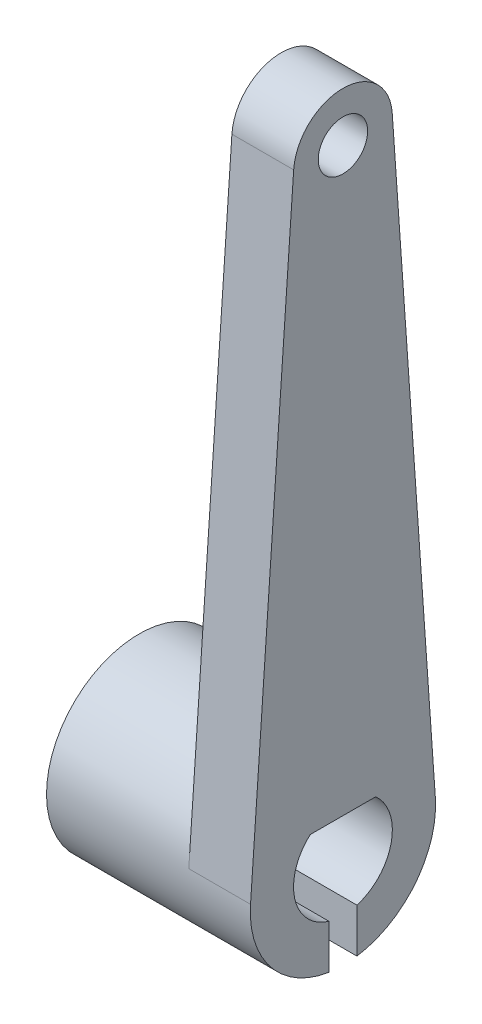
ISO-10303-21;
HEADER;
FILE_DESCRIPTION(('STEP AP214'),'2;1');
FILE_NAME('part.step','',(''),(''),'','','');
FILE_SCHEMA(('AUTOMOTIVE_DESIGN { 1 0 10303 214 1 1 1 1 }'));
ENDSEC;
DATA;
#1=APPLICATION_CONTEXT('core data for automotive mechanical design processes');
#2=APPLICATION_PROTOCOL_DEFINITION('international standard','automotive_design',2000,#1);
#3=PRODUCT_CONTEXT('',#1,'mechanical');
#4=PRODUCT('Part','Part','',(#3));
#5=PRODUCT_RELATED_PRODUCT_CATEGORY('part','',(#4));
#6=PRODUCT_DEFINITION_FORMATION('','',#4);
#7=PRODUCT_DEFINITION_CONTEXT('part definition',#1,'design');
#8=PRODUCT_DEFINITION('design','',#6,#7);
#9=PRODUCT_DEFINITION_SHAPE('','',#8);
#10=(LENGTH_UNIT() NAMED_UNIT(*) SI_UNIT(.MILLI.,.METRE.));
#11=(NAMED_UNIT(*) PLANE_ANGLE_UNIT() SI_UNIT($,.RADIAN.));
#12=(NAMED_UNIT(*) SI_UNIT($,.STERADIAN.) SOLID_ANGLE_UNIT());
#13=UNCERTAINTY_MEASURE_WITH_UNIT(LENGTH_MEASURE(1.E-05),#10,'distance_accuracy_value','');
#14=(GEOMETRIC_REPRESENTATION_CONTEXT(3) GLOBAL_UNCERTAINTY_ASSIGNED_CONTEXT((#13)) GLOBAL_UNIT_ASSIGNED_CONTEXT((#10,
#11,#12)) REPRESENTATION_CONTEXT('',''));
#15=CARTESIAN_POINT('',(0.,0.,0.));
#16=DIRECTION('',(0.,0.,1.));
#17=DIRECTION('',(1.,0.,0.));
#18=AXIS2_PLACEMENT_3D('',#15,#16,#17);
#19=CARTESIAN_POINT('',(-2.5,0.,0.));
#20=DIRECTION('',(1.,0.,0.));
#21=DIRECTION('',(0.,0.,-1.));
#22=AXIS2_PLACEMENT_3D('',#19,#20,#21);
#23=PLANE('',#22);
#24=CARTESIAN_POINT('',(-2.5,50.,0.));
#25=DIRECTION('',(1.,0.,0.));
#26=DIRECTION('',(0.,0.,-1.));
#27=AXIS2_PLACEMENT_3D('',#24,#25,#26);
#28=CIRCLE('',#27,2.);
#29=CARTESIAN_POINT('',(-2.5,50.,-2.));
#30=VERTEX_POINT('',#29);
#31=EDGE_CURVE('E181',#30,#30,#28,.T.);
#32=ORIENTED_EDGE('',*,*,#31,.T.);
#33=EDGE_LOOP('',(#32));
#34=FACE_BOUND('',#33,.T.);
#35=CARTESIAN_POINT('',(-2.5,0.,0.));
#36=DIRECTION('',(-1.,0.,0.));
#37=DIRECTION('',(0.,0.,1.));
#38=AXIS2_PLACEMENT_3D('',#35,#36,#37);
#39=CIRCLE('',#38,7.5);
#40=CARTESIAN_POINT('',(-2.5,0.525,7.48160243530756));
#41=VERTEX_POINT('',#40);
#42=CARTESIAN_POINT('',(-2.5,0.524999999999999,-7.48160243530756));
#43=VERTEX_POINT('',#42);
#44=EDGE_CURVE('E12',#41,#43,#39,.T.);
#45=ORIENTED_EDGE('',*,*,#44,.F.);
#46=DIRECTION('',(0.,0.997546991374341,-0.07));
#47=VECTOR('',#46,1.);
#48=CARTESIAN_POINT('',(-2.5,0.525,7.48160243530756));
#49=LINE('',#48,#47);
#50=CARTESIAN_POINT('',(-2.5,50.28,3.99018796549737));
#51=VERTEX_POINT('',#50);
#52=EDGE_CURVE('E190',#41,#51,#49,.T.);
#53=ORIENTED_EDGE('',*,*,#52,.T.);
#54=CARTESIAN_POINT('',(-2.5,50.,0.));
#55=DIRECTION('',(1.,0.,0.));
#56=DIRECTION('',(0.,0.,-1.));
#57=AXIS2_PLACEMENT_3D('',#54,#55,#56);
#58=CIRCLE('',#57,4.);
#59=CARTESIAN_POINT('',(-2.5,50.28,-3.99018796549737));
#60=VERTEX_POINT('',#59);
#61=EDGE_CURVE('E187',#60,#51,#58,.T.);
#62=ORIENTED_EDGE('',*,*,#61,.F.);
#63=DIRECTION('',(0.,-0.997546991374341,-0.07));
#64=VECTOR('',#63,1.);
#65=CARTESIAN_POINT('',(-2.5,0.525,-7.48160243530756));
#66=LINE('',#65,#64);
#67=EDGE_CURVE('E184',#60,#43,#66,.T.);
#68=ORIENTED_EDGE('',*,*,#67,.T.);
#69=EDGE_LOOP('',(#45,#53,#62,#68));
#70=FACE_BOUND('',#69,.T.);
#71=ADVANCED_FACE('F49',(#34,#70),#23,.F.);
#72=CARTESIAN_POINT('',(-2.5,0.,0.));
#73=DIRECTION('',(1.,0.,0.));
#74=DIRECTION('',(0.,0.,-1.));
#75=AXIS2_PLACEMENT_3D('',#72,#73,#74);
#76=CYLINDRICAL_SURFACE('',#75,4.);
#77=DIRECTION('',(1.,0.,0.));
#78=VECTOR('',#77,1.);
#79=CARTESIAN_POINT('',(-2.5,3.,-2.64575131106459));
#80=LINE('',#79,#78);
#81=CARTESIAN_POINT('',(-14.,3.,-2.64575131106459));
#82=VERTEX_POINT('',#81);
#83=CARTESIAN_POINT('',(2.5,3.,-2.64575131106459));
#84=VERTEX_POINT('',#83);
#85=EDGE_CURVE('E199',#82,#84,#80,.T.);
#86=ORIENTED_EDGE('',*,*,#85,.F.);
#87=CARTESIAN_POINT('',(-14.,0.,0.));
#88=DIRECTION('',(1.,0.,0.));
#89=DIRECTION('',(0.,0.,-1.));
#90=AXIS2_PLACEMENT_3D('',#87,#88,#89);
#91=CIRCLE('',#90,4.);
#92=CARTESIAN_POINT('',(-14.,-3.83648554663436,-1.13197996910971));
#93=VERTEX_POINT('',#92);
#94=EDGE_CURVE('E215',#82,#93,#91,.F.);
#95=ORIENTED_EDGE('',*,*,#94,.T.);
#96=DIRECTION('',(1.,0.,0.));
#97=VECTOR('',#96,1.);
#98=CARTESIAN_POINT('',(-2.5,-3.83648554663436,-1.13197996910971));
#99=LINE('',#98,#97);
#100=CARTESIAN_POINT('',(2.5,-3.83648554663436,-1.13197996910971));
#101=VERTEX_POINT('',#100);
#102=EDGE_CURVE('E133',#101,#93,#99,.F.);
#103=ORIENTED_EDGE('',*,*,#102,.F.);
#104=CARTESIAN_POINT('',(2.5,0.,0.));
#105=DIRECTION('',(1.,0.,0.));
#106=DIRECTION('',(0.,0.,-1.));
#107=AXIS2_PLACEMENT_3D('',#104,#105,#106);
#108=CIRCLE('',#107,4.);
#109=EDGE_CURVE('E163',#101,#84,#108,.T.);
#110=ORIENTED_EDGE('',*,*,#109,.T.);
#111=EDGE_LOOP('',(#86,#95,#103,#110));
#112=FACE_BOUND('',#111,.T.);
#113=ADVANCED_FACE('F222',(#112),#76,.F.);
#114=CARTESIAN_POINT('',(-2.5,0.525,-7.48160243530756));
#115=DIRECTION('',(0.,-0.07,0.997546991374341));
#116=DIRECTION('',(0.,-0.997546991374341,-0.07));
#117=AXIS2_PLACEMENT_3D('',#114,#115,#116);
#118=PLANE('',#117);
#119=DIRECTION('',(1.,0.,0.));
#120=VECTOR('',#119,1.);
#121=CARTESIAN_POINT('',(-2.5,50.28,-3.99018796549737));
#122=LINE('',#121,#120);
#123=CARTESIAN_POINT('',(2.5,50.28,-3.99018796549737));
#124=VERTEX_POINT('',#123);
#125=EDGE_CURVE('E198',#60,#124,#122,.T.);
#126=ORIENTED_EDGE('',*,*,#125,.T.);
#127=DIRECTION('',(0.,-0.997546991374341,-0.07));
#128=VECTOR('',#127,1.);
#129=CARTESIAN_POINT('',(2.5,0.525,-7.48160243530756));
#130=LINE('',#129,#128);
#131=CARTESIAN_POINT('',(2.5,0.524999999999999,-7.48160243530756));
#132=VERTEX_POINT('',#131);
#133=EDGE_CURVE('E168',#124,#132,#130,.T.);
#134=ORIENTED_EDGE('',*,*,#133,.T.);
#135=DIRECTION('',(1.,0.,0.));
#136=VECTOR('',#135,1.);
#137=CARTESIAN_POINT('',(-2.5,0.524999999999999,-7.48160243530756));
#138=LINE('',#137,#136);
#139=EDGE_CURVE('E58',#43,#132,#138,.T.);
#140=ORIENTED_EDGE('',*,*,#139,.F.);
#141=ORIENTED_EDGE('',*,*,#67,.F.);
#142=EDGE_LOOP('',(#126,#134,#140,#141));
#143=FACE_BOUND('',#142,.T.);
#144=ADVANCED_FACE('F228',(#143),#118,.F.);
#145=CARTESIAN_POINT('',(-2.5,0.,0.));
#146=DIRECTION('',(1.,0.,0.));
#147=DIRECTION('',(0.,0.,-1.));
#148=AXIS2_PLACEMENT_3D('',#145,#146,#147);
#149=CYLINDRICAL_SURFACE('',#148,7.5);
#150=DIRECTION('',(1.,0.,0.));
#151=VECTOR('',#150,1.);
#152=CARTESIAN_POINT('',(-2.5,-7.41408263708561,1.13197996910972));
#153=LINE('',#152,#151);
#154=CARTESIAN_POINT('',(-14.,-7.41408263708562,1.13197996910972));
#155=VERTEX_POINT('',#154);
#156=CARTESIAN_POINT('',(2.5,-7.41408263708561,1.13197996910972));
#157=VERTEX_POINT('',#156);
#158=EDGE_CURVE('E132',#155,#157,#153,.T.);
#159=ORIENTED_EDGE('',*,*,#158,.T.);
#160=CARTESIAN_POINT('',(2.5,0.,0.));
#161=DIRECTION('',(1.,0.,0.));
#162=DIRECTION('',(0.,0.,-1.));
#163=AXIS2_PLACEMENT_3D('',#160,#161,#162);
#164=CIRCLE('',#163,7.5);
#165=CARTESIAN_POINT('',(2.5,0.525,7.48160243530756));
#166=VERTEX_POINT('',#165);
#167=EDGE_CURVE('E178',#166,#157,#164,.T.);
#168=ORIENTED_EDGE('',*,*,#167,.F.);
#169=DIRECTION('',(1.,0.,0.));
#170=VECTOR('',#169,1.);
#171=CARTESIAN_POINT('',(-2.5,0.525,7.48160243530756));
#172=LINE('',#171,#170);
#173=EDGE_CURVE('E194',#41,#166,#172,.T.);
#174=ORIENTED_EDGE('',*,*,#173,.F.);
#175=ORIENTED_EDGE('',*,*,#44,.T.);
#176=ORIENTED_EDGE('',*,*,#139,.T.);
#177=CARTESIAN_POINT('',(2.5,-7.41408263708561,-1.13197996910971));
#178=VERTEX_POINT('',#177);
#179=EDGE_CURVE('E177',#178,#132,#164,.T.);
#180=ORIENTED_EDGE('',*,*,#179,.F.);
#181=DIRECTION('',(1.,0.,0.));
#182=VECTOR('',#181,1.);
#183=CARTESIAN_POINT('',(-2.5,-7.41408263708561,-1.13197996910972));
#184=LINE('',#183,#182);
#185=CARTESIAN_POINT('',(-14.,-7.41408263708561,-1.13197996910972));
#186=VERTEX_POINT('',#185);
#187=EDGE_CURVE('E66',#178,#186,#184,.F.);
#188=ORIENTED_EDGE('',*,*,#187,.T.);
#189=CARTESIAN_POINT('',(-14.,0.,0.));
#190=DIRECTION('',(1.,0.,0.));
#191=DIRECTION('',(0.,0.,-1.));
#192=AXIS2_PLACEMENT_3D('',#189,#190,#191);
#193=CIRCLE('',#192,7.5);
#194=EDGE_CURVE('E152',#186,#155,#193,.T.);
#195=ORIENTED_EDGE('',*,*,#194,.T.);
#196=EDGE_LOOP('',(#159,#168,#174,#175,#176,#180,#188,#195));
#197=FACE_BOUND('',#196,.T.);
#198=ADVANCED_FACE('F211',(#197),#149,.T.);
#199=CARTESIAN_POINT('',(-2.5,0.525,7.48160243530756));
#200=DIRECTION('',(0.,-0.07,-0.997546991374341));
#201=DIRECTION('',(0.,0.997546991374341,-0.07));
#202=AXIS2_PLACEMENT_3D('',#199,#200,#201);
#203=PLANE('',#202);
#204=ORIENTED_EDGE('',*,*,#173,.T.);
#205=DIRECTION('',(0.,0.997546991374341,-0.07));
#206=VECTOR('',#205,1.);
#207=CARTESIAN_POINT('',(2.5,0.525,7.48160243530756));
#208=LINE('',#207,#206);
#209=CARTESIAN_POINT('',(2.5,50.28,3.99018796549737));
#210=VERTEX_POINT('',#209);
#211=EDGE_CURVE('E174',#166,#210,#208,.T.);
#212=ORIENTED_EDGE('',*,*,#211,.T.);
#213=DIRECTION('',(1.,0.,0.));
#214=VECTOR('',#213,1.);
#215=CARTESIAN_POINT('',(-2.5,50.28,3.99018796549737));
#216=LINE('',#215,#214);
#217=EDGE_CURVE('E196',#51,#210,#216,.T.);
#218=ORIENTED_EDGE('',*,*,#217,.F.);
#219=ORIENTED_EDGE('',*,*,#52,.F.);
#220=EDGE_LOOP('',(#204,#212,#218,#219));
#221=FACE_BOUND('',#220,.T.);
#222=ADVANCED_FACE('F233',(#221),#203,.F.);
#223=CARTESIAN_POINT('',(2.5,3.,2.64575131106459));
#224=VERTEX_POINT('',#223);
#225=CARTESIAN_POINT('',(2.5,-3.83648554663436,1.13197996910972));
#226=VERTEX_POINT('',#225);
#227=EDGE_CURVE('E131',#224,#226,#108,.T.);
#228=ORIENTED_EDGE('',*,*,#227,.T.);
#229=DIRECTION('',(1.,0.,0.));
#230=VECTOR('',#229,1.);
#231=CARTESIAN_POINT('',(-2.5,-3.83648554663436,1.13197996910971));
#232=LINE('',#231,#230);
#233=CARTESIAN_POINT('',(-14.,-3.83648554663436,1.13197996910972));
#234=VERTEX_POINT('',#233);
#235=EDGE_CURVE('E74',#234,#226,#232,.T.);
#236=ORIENTED_EDGE('',*,*,#235,.F.);
#237=CARTESIAN_POINT('',(-14.,0.,0.));
#238=DIRECTION('',(1.,0.,0.));
#239=DIRECTION('',(0.,0.,-1.));
#240=AXIS2_PLACEMENT_3D('',#237,#238,#239);
#241=CIRCLE('',#240,4.);
#242=CARTESIAN_POINT('',(-14.,3.,2.64575131106459));
#243=VERTEX_POINT('',#242);
#244=EDGE_CURVE('E129',#234,#243,#241,.F.);
#245=ORIENTED_EDGE('',*,*,#244,.T.);
#246=DIRECTION('',(1.,0.,0.));
#247=VECTOR('',#246,1.);
#248=CARTESIAN_POINT('',(-2.5,3.,2.64575131106459));
#249=LINE('',#248,#247);
#250=EDGE_CURVE('E53',#243,#224,#249,.T.);
#251=ORIENTED_EDGE('',*,*,#250,.T.);
#252=EDGE_LOOP('',(#228,#236,#245,#251));
#253=FACE_BOUND('',#252,.T.);
#254=ADVANCED_FACE('F128',(#253),#76,.F.);
#255=CARTESIAN_POINT('',(-2.5,3.,0.));
#256=DIRECTION('',(0.,-1.,0.));
#257=DIRECTION('',(0.,0.,-1.));
#258=AXIS2_PLACEMENT_3D('',#255,#256,#257);
#259=PLANE('',#258);
#260=ORIENTED_EDGE('',*,*,#85,.T.);
#261=DIRECTION('',(0.,0.,-1.));
#262=VECTOR('',#261,1.);
#263=CARTESIAN_POINT('',(2.5,3.,0.));
#264=LINE('',#263,#262);
#265=EDGE_CURVE('E165',#224,#84,#264,.T.);
#266=ORIENTED_EDGE('',*,*,#265,.F.);
#267=ORIENTED_EDGE('',*,*,#250,.F.);
#268=DIRECTION('',(0.,0.,-1.));
#269=VECTOR('',#268,1.);
#270=CARTESIAN_POINT('',(-14.,3.,0.));
#271=LINE('',#270,#269);
#272=EDGE_CURVE('E145',#243,#82,#271,.T.);
#273=ORIENTED_EDGE('',*,*,#272,.T.);
#274=EDGE_LOOP('',(#260,#266,#267,#273));
#275=FACE_BOUND('',#274,.T.);
#276=ADVANCED_FACE('F203',(#275),#259,.T.);
#277=CARTESIAN_POINT('',(-2.5,50.,0.));
#278=DIRECTION('',(1.,0.,0.));
#279=DIRECTION('',(0.,0.,-1.));
#280=AXIS2_PLACEMENT_3D('',#277,#278,#279);
#281=CYLINDRICAL_SURFACE('',#280,2.);
#282=ORIENTED_EDGE('',*,*,#31,.F.);
#283=EDGE_LOOP('',(#282));
#284=FACE_BOUND('',#283,.T.);
#285=CARTESIAN_POINT('',(2.5,50.,0.));
#286=DIRECTION('',(1.,0.,0.));
#287=DIRECTION('',(0.,0.,-1.));
#288=AXIS2_PLACEMENT_3D('',#285,#286,#287);
#289=CIRCLE('',#288,2.);
#290=CARTESIAN_POINT('',(2.5,50.,-2.));
#291=VERTEX_POINT('',#290);
#292=EDGE_CURVE('E160',#291,#291,#289,.T.);
#293=ORIENTED_EDGE('',*,*,#292,.T.);
#294=EDGE_LOOP('',(#293));
#295=FACE_BOUND('',#294,.T.);
#296=ADVANCED_FACE('F51',(#284,#295),#281,.F.);
#297=CARTESIAN_POINT('',(-2.5,50.,0.));
#298=DIRECTION('',(1.,0.,0.));
#299=DIRECTION('',(0.,0.,-1.));
#300=AXIS2_PLACEMENT_3D('',#297,#298,#299);
#301=CYLINDRICAL_SURFACE('',#300,4.);
#302=ORIENTED_EDGE('',*,*,#217,.T.);
#303=CARTESIAN_POINT('',(2.5,50.,0.));
#304=DIRECTION('',(1.,0.,0.));
#305=DIRECTION('',(0.,0.,-1.));
#306=AXIS2_PLACEMENT_3D('',#303,#304,#305);
#307=CIRCLE('',#306,4.);
#308=EDGE_CURVE('E171',#124,#210,#307,.T.);
#309=ORIENTED_EDGE('',*,*,#308,.F.);
#310=ORIENTED_EDGE('',*,*,#125,.F.);
#311=ORIENTED_EDGE('',*,*,#61,.T.);
#312=EDGE_LOOP('',(#302,#309,#310,#311));
#313=FACE_BOUND('',#312,.T.);
#314=ADVANCED_FACE('F237',(#313),#301,.T.);
#315=CARTESIAN_POINT('',(2.5,0.,0.));
#316=DIRECTION('',(1.,0.,0.));
#317=DIRECTION('',(0.,0.,-1.));
#318=AXIS2_PLACEMENT_3D('',#315,#316,#317);
#319=PLANE('',#318);
#320=DIRECTION('',(0.,1.,0.));
#321=VECTOR('',#320,1.);
#322=CARTESIAN_POINT('',(2.5,-11.1635144533656,-1.13197996910972));
#323=LINE('',#322,#321);
#324=EDGE_CURVE('E156',#178,#101,#323,.T.);
#325=ORIENTED_EDGE('',*,*,#324,.F.);
#326=ORIENTED_EDGE('',*,*,#179,.T.);
#327=ORIENTED_EDGE('',*,*,#133,.F.);
#328=ORIENTED_EDGE('',*,*,#308,.T.);
#329=ORIENTED_EDGE('',*,*,#211,.F.);
#330=ORIENTED_EDGE('',*,*,#167,.T.);
#331=DIRECTION('',(0.,-1.,0.));
#332=VECTOR('',#331,1.);
#333=CARTESIAN_POINT('',(2.5,-11.1635144533656,1.13197996910972));
#334=LINE('',#333,#332);
#335=EDGE_CURVE('E158',#226,#157,#334,.T.);
#336=ORIENTED_EDGE('',*,*,#335,.F.);
#337=ORIENTED_EDGE('',*,*,#227,.F.);
#338=ORIENTED_EDGE('',*,*,#265,.T.);
#339=ORIENTED_EDGE('',*,*,#109,.F.);
#340=EDGE_LOOP('',(#325,#326,#327,#328,#329,#330,#336,#337,#338,#339));
#341=FACE_BOUND('',#340,.T.);
#342=ORIENTED_EDGE('',*,*,#292,.F.);
#343=EDGE_LOOP('',(#342));
#344=FACE_BOUND('',#343,.T.);
#345=ADVANCED_FACE('F206',(#341,#344),#319,.T.);
#346=CARTESIAN_POINT('',(-2.501,-11.1635144533656,1.13197996910972));
#347=DIRECTION('',(0.,0.,1.));
#348=DIRECTION('',(1.,0.,0.));
#349=AXIS2_PLACEMENT_3D('',#346,#347,#348);
#350=PLANE('',#349);
#351=ORIENTED_EDGE('',*,*,#158,.F.);
#352=DIRECTION('',(0.,1.,0.));
#353=VECTOR('',#352,1.);
#354=CARTESIAN_POINT('',(-14.,0.,1.13197996910972));
#355=LINE('',#354,#353);
#356=EDGE_CURVE('E141',#155,#234,#355,.T.);
#357=ORIENTED_EDGE('',*,*,#356,.T.);
#358=ORIENTED_EDGE('',*,*,#235,.T.);
#359=ORIENTED_EDGE('',*,*,#335,.T.);
#360=EDGE_LOOP('',(#351,#357,#358,#359));
#361=FACE_BOUND('',#360,.T.);
#362=ADVANCED_FACE('F147',(#361),#350,.F.);
#363=CARTESIAN_POINT('',(-2.501,-11.1635144533656,-1.13197996910972));
#364=DIRECTION('',(0.,0.,-1.));
#365=DIRECTION('',(-1.,0.,0.));
#366=AXIS2_PLACEMENT_3D('',#363,#364,#365);
#367=PLANE('',#366);
#368=ORIENTED_EDGE('',*,*,#324,.T.);
#369=ORIENTED_EDGE('',*,*,#102,.T.);
#370=DIRECTION('',(0.,-1.,0.));
#371=VECTOR('',#370,1.);
#372=CARTESIAN_POINT('',(-14.,0.,-1.13197996910972));
#373=LINE('',#372,#371);
#374=EDGE_CURVE('E214',#93,#186,#373,.T.);
#375=ORIENTED_EDGE('',*,*,#374,.T.);
#376=ORIENTED_EDGE('',*,*,#187,.F.);
#377=EDGE_LOOP('',(#368,#369,#375,#376));
#378=FACE_BOUND('',#377,.T.);
#379=ADVANCED_FACE('F223',(#378),#367,.F.);
#380=CARTESIAN_POINT('',(-14.,0.,0.));
#381=DIRECTION('',(1.,0.,0.));
#382=DIRECTION('',(0.,0.,-1.));
#383=AXIS2_PLACEMENT_3D('',#380,#381,#382);
#384=PLANE('',#383);
#385=ORIENTED_EDGE('',*,*,#374,.F.);
#386=ORIENTED_EDGE('',*,*,#94,.F.);
#387=ORIENTED_EDGE('',*,*,#272,.F.);
#388=ORIENTED_EDGE('',*,*,#244,.F.);
#389=ORIENTED_EDGE('',*,*,#356,.F.);
#390=ORIENTED_EDGE('',*,*,#194,.F.);
#391=EDGE_LOOP('',(#385,#386,#387,#388,#389,#390));
#392=FACE_BOUND('',#391,.T.);
#393=ADVANCED_FACE('F139',(#392),#384,.F.);
#394=CLOSED_SHELL('',(#71,#113,#144,#198,#222,#254,#276,#296,#314,#345,#362,#379,#393));
#395=MANIFOLD_SOLID_BREP('B2',#394);
#396=ADVANCED_BREP_SHAPE_REPRESENTATION('',(#18,#395),#14);
#397=SHAPE_DEFINITION_REPRESENTATION(#9,#396);
ENDSEC;
END-ISO-10303-21;
